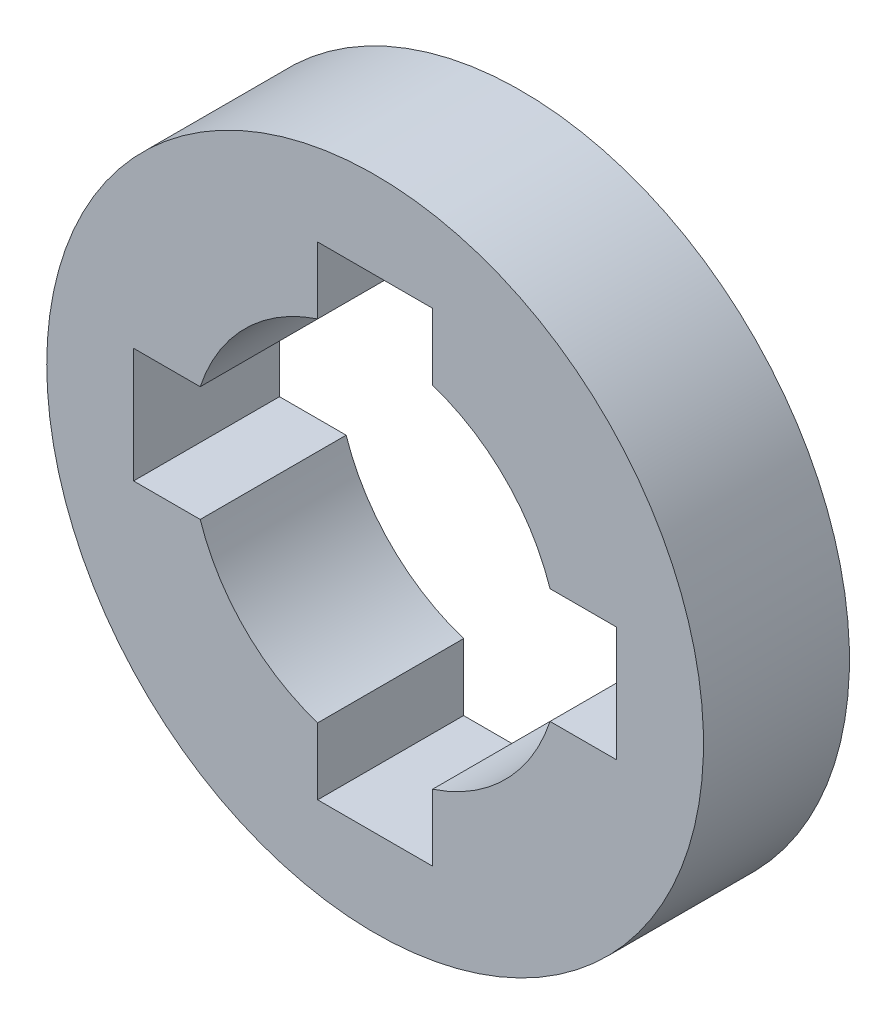
ISO-10303-21;
HEADER;
FILE_DESCRIPTION(('STEP AP214'),'2;1');
FILE_NAME('part.step','',(''),(''),'','','');
FILE_SCHEMA(('AUTOMOTIVE_DESIGN { 1 0 10303 214 1 1 1 1 }'));
ENDSEC;
DATA;
#1=APPLICATION_CONTEXT('core data for automotive mechanical design processes');
#2=APPLICATION_PROTOCOL_DEFINITION('international standard','automotive_design',2000,#1);
#3=PRODUCT_CONTEXT('',#1,'mechanical');
#4=PRODUCT('Part','Part','',(#3));
#5=PRODUCT_RELATED_PRODUCT_CATEGORY('part','',(#4));
#6=PRODUCT_DEFINITION_FORMATION('','',#4);
#7=PRODUCT_DEFINITION_CONTEXT('part definition',#1,'design');
#8=PRODUCT_DEFINITION('design','',#6,#7);
#9=PRODUCT_DEFINITION_SHAPE('','',#8);
#10=(LENGTH_UNIT() NAMED_UNIT(*) SI_UNIT(.MILLI.,.METRE.));
#11=(NAMED_UNIT(*) PLANE_ANGLE_UNIT() SI_UNIT($,.RADIAN.));
#12=(NAMED_UNIT(*) SI_UNIT($,.STERADIAN.) SOLID_ANGLE_UNIT());
#13=UNCERTAINTY_MEASURE_WITH_UNIT(LENGTH_MEASURE(1.E-05),#10,'distance_accuracy_value','');
#14=(GEOMETRIC_REPRESENTATION_CONTEXT(3) GLOBAL_UNCERTAINTY_ASSIGNED_CONTEXT((#13)) GLOBAL_UNIT_ASSIGNED_CONTEXT((#10,
#11,#12)) REPRESENTATION_CONTEXT('',''));
#15=CARTESIAN_POINT('',(0.,0.,0.));
#16=DIRECTION('',(0.,0.,1.));
#17=DIRECTION('',(1.,0.,0.));
#18=AXIS2_PLACEMENT_3D('',#15,#16,#17);
#19=CARTESIAN_POINT('',(0.,1.25,1.5875));
#20=DIRECTION('',(0.,1.,0.));
#21=DIRECTION('',(0.,0.,1.));
#22=AXIS2_PLACEMENT_3D('',#19,#20,#21);
#23=PLANE('',#22);
#24=DIRECTION('',(0.,0.,-1.));
#25=VECTOR('',#24,1.);
#26=CARTESIAN_POINT('',(5.255,1.25,1.5875));
#27=LINE('',#26,#25);
#28=CARTESIAN_POINT('',(5.255,1.25,-1.5875));
#29=VERTEX_POINT('',#28);
#30=CARTESIAN_POINT('',(5.255,1.25,1.5875));
#31=VERTEX_POINT('',#30);
#32=EDGE_CURVE('E151',#29,#31,#27,.F.);
#33=ORIENTED_EDGE('',*,*,#32,.T.);
#34=DIRECTION('',(1.,0.,0.));
#35=VECTOR('',#34,1.);
#36=CARTESIAN_POINT('',(0.,1.25,1.5875));
#37=LINE('',#36,#35);
#38=CARTESIAN_POINT('',(3.80493429641039,1.25,1.5875));
#39=VERTEX_POINT('',#38);
#40=EDGE_CURVE('E223',#39,#31,#37,.T.);
#41=ORIENTED_EDGE('',*,*,#40,.F.);
#42=DIRECTION('',(0.,0.,-1.));
#43=VECTOR('',#42,1.);
#44=CARTESIAN_POINT('',(3.80493429641039,1.25,1.5875));
#45=LINE('',#44,#43);
#46=CARTESIAN_POINT('',(3.80493429641039,1.25,-1.5875));
#47=VERTEX_POINT('',#46);
#48=EDGE_CURVE('E126',#39,#47,#45,.T.);
#49=ORIENTED_EDGE('',*,*,#48,.T.);
#50=DIRECTION('',(1.,0.,0.));
#51=VECTOR('',#50,1.);
#52=CARTESIAN_POINT('',(0.,1.25,-1.5875));
#53=LINE('',#52,#51);
#54=EDGE_CURVE('E148',#47,#29,#53,.T.);
#55=ORIENTED_EDGE('',*,*,#54,.T.);
#56=EDGE_LOOP('',(#33,#41,#49,#55));
#57=FACE_BOUND('',#56,.T.);
#58=ADVANCED_FACE('F17',(#57),#23,.F.);
#59=CARTESIAN_POINT('',(0.,-1.25,1.5875));
#60=DIRECTION('',(0.,1.,0.));
#61=DIRECTION('',(0.,0.,1.));
#62=AXIS2_PLACEMENT_3D('',#59,#60,#61);
#63=PLANE('',#62);
#64=DIRECTION('',(1.,0.,0.));
#65=VECTOR('',#64,1.);
#66=CARTESIAN_POINT('',(0.,-1.25,1.5875));
#67=LINE('',#66,#65);
#68=CARTESIAN_POINT('',(3.80493429641039,-1.25,1.5875));
#69=VERTEX_POINT('',#68);
#70=CARTESIAN_POINT('',(5.255,-1.25,1.5875));
#71=VERTEX_POINT('',#70);
#72=EDGE_CURVE('E219',#69,#71,#67,.T.);
#73=ORIENTED_EDGE('',*,*,#72,.T.);
#74=DIRECTION('',(0.,0.,-1.));
#75=VECTOR('',#74,1.);
#76=CARTESIAN_POINT('',(5.255,-1.25,1.5875));
#77=LINE('',#76,#75);
#78=CARTESIAN_POINT('',(5.255,-1.25,-1.5875));
#79=VERTEX_POINT('',#78);
#80=EDGE_CURVE('E285',#71,#79,#77,.T.);
#81=ORIENTED_EDGE('',*,*,#80,.T.);
#82=DIRECTION('',(1.,0.,0.));
#83=VECTOR('',#82,1.);
#84=CARTESIAN_POINT('',(0.,-1.25,-1.5875));
#85=LINE('',#84,#83);
#86=CARTESIAN_POINT('',(3.80493429641039,-1.25,-1.5875));
#87=VERTEX_POINT('',#86);
#88=EDGE_CURVE('E189',#79,#87,#85,.F.);
#89=ORIENTED_EDGE('',*,*,#88,.T.);
#90=DIRECTION('',(0.,0.,-1.));
#91=VECTOR('',#90,1.);
#92=CARTESIAN_POINT('',(3.80493429641039,-1.25,1.5875));
#93=LINE('',#92,#91);
#94=EDGE_CURVE('E293',#87,#69,#93,.F.);
#95=ORIENTED_EDGE('',*,*,#94,.T.);
#96=EDGE_LOOP('',(#73,#81,#89,#95));
#97=FACE_BOUND('',#96,.T.);
#98=ADVANCED_FACE('F386',(#97),#63,.T.);
#99=CARTESIAN_POINT('',(1.25,0.,1.5875));
#100=DIRECTION('',(1.,0.,0.));
#101=DIRECTION('',(0.,1.,0.));
#102=AXIS2_PLACEMENT_3D('',#99,#100,#101);
#103=PLANE('',#102);
#104=DIRECTION('',(0.,0.,1.));
#105=VECTOR('',#104,1.);
#106=CARTESIAN_POINT('',(1.25,-5.255,1.5875));
#107=LINE('',#106,#105);
#108=CARTESIAN_POINT('',(1.25,-5.255,1.5875));
#109=VERTEX_POINT('',#108);
#110=CARTESIAN_POINT('',(1.25,-5.255,-1.5875));
#111=VERTEX_POINT('',#110);
#112=EDGE_CURVE('E271',#109,#111,#107,.F.);
#113=ORIENTED_EDGE('',*,*,#112,.F.);
#114=DIRECTION('',(0.,1.,0.));
#115=VECTOR('',#114,1.);
#116=CARTESIAN_POINT('',(1.25,0.,1.5875));
#117=LINE('',#116,#115);
#118=CARTESIAN_POINT('',(1.25,-3.80493429641039,1.5875));
#119=VERTEX_POINT('',#118);
#120=EDGE_CURVE('E215',#119,#109,#117,.F.);
#121=ORIENTED_EDGE('',*,*,#120,.F.);
#122=DIRECTION('',(0.,0.,-1.));
#123=VECTOR('',#122,1.);
#124=CARTESIAN_POINT('',(1.25,-3.80493429641038,1.5875));
#125=LINE('',#124,#123);
#126=CARTESIAN_POINT('',(1.25,-3.80493429641039,-1.5875));
#127=VERTEX_POINT('',#126);
#128=EDGE_CURVE('E163',#119,#127,#125,.T.);
#129=ORIENTED_EDGE('',*,*,#128,.T.);
#130=DIRECTION('',(0.,1.,0.));
#131=VECTOR('',#130,1.);
#132=CARTESIAN_POINT('',(1.25,0.,-1.5875));
#133=LINE('',#132,#131);
#134=EDGE_CURVE('E184',#127,#111,#133,.F.);
#135=ORIENTED_EDGE('',*,*,#134,.T.);
#136=EDGE_LOOP('',(#113,#121,#129,#135));
#137=FACE_BOUND('',#136,.T.);
#138=ADVANCED_FACE('F553',(#137),#103,.F.);
#139=CARTESIAN_POINT('',(-1.25,0.,1.5875));
#140=DIRECTION('',(1.,0.,0.));
#141=DIRECTION('',(0.,1.,0.));
#142=AXIS2_PLACEMENT_3D('',#139,#140,#141);
#143=PLANE('',#142);
#144=DIRECTION('',(0.,1.,0.));
#145=VECTOR('',#144,1.);
#146=CARTESIAN_POINT('',(-1.25,0.,1.5875));
#147=LINE('',#146,#145);
#148=CARTESIAN_POINT('',(-1.25,-3.80493429641039,1.5875));
#149=VERTEX_POINT('',#148);
#150=CARTESIAN_POINT('',(-1.25,-5.255,1.5875));
#151=VERTEX_POINT('',#150);
#152=EDGE_CURVE('E211',#149,#151,#147,.F.);
#153=ORIENTED_EDGE('',*,*,#152,.T.);
#154=DIRECTION('',(0.,0.,1.));
#155=VECTOR('',#154,1.);
#156=CARTESIAN_POINT('',(-1.25,-5.255,1.5875));
#157=LINE('',#156,#155);
#158=CARTESIAN_POINT('',(-1.25,-5.255,-1.5875));
#159=VERTEX_POINT('',#158);
#160=EDGE_CURVE('E268',#159,#151,#157,.T.);
#161=ORIENTED_EDGE('',*,*,#160,.F.);
#162=DIRECTION('',(0.,1.,0.));
#163=VECTOR('',#162,1.);
#164=CARTESIAN_POINT('',(-1.25,0.,-1.5875));
#165=LINE('',#164,#163);
#166=CARTESIAN_POINT('',(-1.25,-3.80493429641039,-1.5875));
#167=VERTEX_POINT('',#166);
#168=EDGE_CURVE('E180',#159,#167,#165,.T.);
#169=ORIENTED_EDGE('',*,*,#168,.T.);
#170=DIRECTION('',(0.,0.,-1.));
#171=VECTOR('',#170,1.);
#172=CARTESIAN_POINT('',(-1.25,-3.80493429641039,1.5875));
#173=LINE('',#172,#171);
#174=EDGE_CURVE('E282',#167,#149,#173,.F.);
#175=ORIENTED_EDGE('',*,*,#174,.T.);
#176=EDGE_LOOP('',(#153,#161,#169,#175));
#177=FACE_BOUND('',#176,.T.);
#178=ADVANCED_FACE('F544',(#177),#143,.T.);
#179=CARTESIAN_POINT('',(0.,-1.25,1.5875));
#180=DIRECTION('',(0.,1.,0.));
#181=DIRECTION('',(0.,0.,1.));
#182=AXIS2_PLACEMENT_3D('',#179,#180,#181);
#183=PLANE('',#182);
#184=DIRECTION('',(1.,0.,0.));
#185=VECTOR('',#184,1.);
#186=CARTESIAN_POINT('',(0.,-1.25,1.5875));
#187=LINE('',#186,#185);
#188=CARTESIAN_POINT('',(-5.255,-1.25,1.5875));
#189=VERTEX_POINT('',#188);
#190=CARTESIAN_POINT('',(-3.80493429641039,-1.25,1.5875));
#191=VERTEX_POINT('',#190);
#192=EDGE_CURVE('E207',#189,#191,#187,.T.);
#193=ORIENTED_EDGE('',*,*,#192,.T.);
#194=DIRECTION('',(0.,0.,-1.));
#195=VECTOR('',#194,1.);
#196=CARTESIAN_POINT('',(-3.80493429641039,-1.25,1.5875));
#197=LINE('',#196,#195);
#198=CARTESIAN_POINT('',(-3.80493429641039,-1.25,-1.5875));
#199=VERTEX_POINT('',#198);
#200=EDGE_CURVE('E342',#191,#199,#197,.T.);
#201=ORIENTED_EDGE('',*,*,#200,.T.);
#202=DIRECTION('',(1.,0.,0.));
#203=VECTOR('',#202,1.);
#204=CARTESIAN_POINT('',(0.,-1.25,-1.5875));
#205=LINE('',#204,#203);
#206=CARTESIAN_POINT('',(-5.255,-1.25,-1.5875));
#207=VERTEX_POINT('',#206);
#208=EDGE_CURVE('E175',#199,#207,#205,.F.);
#209=ORIENTED_EDGE('',*,*,#208,.T.);
#210=DIRECTION('',(0.,0.,-1.));
#211=VECTOR('',#210,1.);
#212=CARTESIAN_POINT('',(-5.255,-1.25,1.5875));
#213=LINE('',#212,#211);
#214=EDGE_CURVE('E254',#189,#207,#213,.T.);
#215=ORIENTED_EDGE('',*,*,#214,.F.);
#216=EDGE_LOOP('',(#193,#201,#209,#215));
#217=FACE_BOUND('',#216,.T.);
#218=ADVANCED_FACE('F408',(#217),#183,.T.);
#219=CARTESIAN_POINT('',(0.,1.25,1.5875));
#220=DIRECTION('',(0.,1.,0.));
#221=DIRECTION('',(0.,0.,1.));
#222=AXIS2_PLACEMENT_3D('',#219,#220,#221);
#223=PLANE('',#222);
#224=DIRECTION('',(0.,0.,-1.));
#225=VECTOR('',#224,1.);
#226=CARTESIAN_POINT('',(-3.80493429641039,1.25,1.5875));
#227=LINE('',#226,#225);
#228=CARTESIAN_POINT('',(-3.80493429641039,1.25,-1.5875));
#229=VERTEX_POINT('',#228);
#230=CARTESIAN_POINT('',(-3.80493429641039,1.25,1.5875));
#231=VERTEX_POINT('',#230);
#232=EDGE_CURVE('E265',#229,#231,#227,.F.);
#233=ORIENTED_EDGE('',*,*,#232,.T.);
#234=DIRECTION('',(1.,0.,0.));
#235=VECTOR('',#234,1.);
#236=CARTESIAN_POINT('',(0.,1.25,1.5875));
#237=LINE('',#236,#235);
#238=CARTESIAN_POINT('',(-5.255,1.25,1.5875));
#239=VERTEX_POINT('',#238);
#240=EDGE_CURVE('E202',#239,#231,#237,.T.);
#241=ORIENTED_EDGE('',*,*,#240,.F.);
#242=DIRECTION('',(0.,0.,-1.));
#243=VECTOR('',#242,1.);
#244=CARTESIAN_POINT('',(-5.255,1.25,1.5875));
#245=LINE('',#244,#243);
#246=CARTESIAN_POINT('',(-5.255,1.25,-1.5875));
#247=VERTEX_POINT('',#246);
#248=EDGE_CURVE('E250',#247,#239,#245,.F.);
#249=ORIENTED_EDGE('',*,*,#248,.F.);
#250=DIRECTION('',(1.,0.,0.));
#251=VECTOR('',#250,1.);
#252=CARTESIAN_POINT('',(0.,1.25,-1.5875));
#253=LINE('',#252,#251);
#254=EDGE_CURVE('E171',#247,#229,#253,.T.);
#255=ORIENTED_EDGE('',*,*,#254,.T.);
#256=EDGE_LOOP('',(#233,#241,#249,#255));
#257=FACE_BOUND('',#256,.T.);
#258=ADVANCED_FACE('F364',(#257),#223,.F.);
#259=CARTESIAN_POINT('',(-1.25,0.,1.5875));
#260=DIRECTION('',(1.,0.,0.));
#261=DIRECTION('',(0.,1.,0.));
#262=AXIS2_PLACEMENT_3D('',#259,#260,#261);
#263=PLANE('',#262);
#264=DIRECTION('',(0.,1.,0.));
#265=VECTOR('',#264,1.);
#266=CARTESIAN_POINT('',(-1.25,0.,1.5875));
#267=LINE('',#266,#265);
#268=CARTESIAN_POINT('',(-1.25,5.255,1.5875));
#269=VERTEX_POINT('',#268);
#270=CARTESIAN_POINT('',(-1.25,3.80493429641039,1.5875));
#271=VERTEX_POINT('',#270);
#272=EDGE_CURVE('E199',#269,#271,#267,.F.);
#273=ORIENTED_EDGE('',*,*,#272,.T.);
#274=DIRECTION('',(0.,0.,-1.));
#275=VECTOR('',#274,1.);
#276=CARTESIAN_POINT('',(-1.25,3.80493429641039,1.5875));
#277=LINE('',#276,#275);
#278=CARTESIAN_POINT('',(-1.25,3.80493429641039,-1.5875));
#279=VERTEX_POINT('',#278);
#280=EDGE_CURVE('E340',#271,#279,#277,.T.);
#281=ORIENTED_EDGE('',*,*,#280,.T.);
#282=DIRECTION('',(0.,1.,0.));
#283=VECTOR('',#282,1.);
#284=CARTESIAN_POINT('',(-1.25,0.,-1.5875));
#285=LINE('',#284,#283);
#286=CARTESIAN_POINT('',(-1.25,5.255,-1.5875));
#287=VERTEX_POINT('',#286);
#288=EDGE_CURVE('E143',#279,#287,#285,.T.);
#289=ORIENTED_EDGE('',*,*,#288,.T.);
#290=DIRECTION('',(0.,0.,1.));
#291=VECTOR('',#290,1.);
#292=CARTESIAN_POINT('',(-1.25,5.255,1.5875));
#293=LINE('',#292,#291);
#294=EDGE_CURVE('E236',#287,#269,#293,.T.);
#295=ORIENTED_EDGE('',*,*,#294,.T.);
#296=EDGE_LOOP('',(#273,#281,#289,#295));
#297=FACE_BOUND('',#296,.T.);
#298=ADVANCED_FACE('F399',(#297),#263,.T.);
#299=CARTESIAN_POINT('',(1.25,0.,1.5875));
#300=DIRECTION('',(1.,0.,0.));
#301=DIRECTION('',(0.,1.,0.));
#302=AXIS2_PLACEMENT_3D('',#299,#300,#301);
#303=PLANE('',#302);
#304=DIRECTION('',(0.,0.,-1.));
#305=VECTOR('',#304,1.);
#306=CARTESIAN_POINT('',(1.25,3.80493429641039,1.5875));
#307=LINE('',#306,#305);
#308=CARTESIAN_POINT('',(1.25,3.80493429641039,-1.5875));
#309=VERTEX_POINT('',#308);
#310=CARTESIAN_POINT('',(1.25,3.80493429641039,1.5875));
#311=VERTEX_POINT('',#310);
#312=EDGE_CURVE('E136',#309,#311,#307,.F.);
#313=ORIENTED_EDGE('',*,*,#312,.T.);
#314=DIRECTION('',(0.,1.,0.));
#315=VECTOR('',#314,1.);
#316=CARTESIAN_POINT('',(1.25,0.,1.5875));
#317=LINE('',#316,#315);
#318=CARTESIAN_POINT('',(1.25,5.255,1.5875));
#319=VERTEX_POINT('',#318);
#320=EDGE_CURVE('E39',#319,#311,#317,.F.);
#321=ORIENTED_EDGE('',*,*,#320,.F.);
#322=DIRECTION('',(0.,0.,1.));
#323=VECTOR('',#322,1.);
#324=CARTESIAN_POINT('',(1.25,5.255,1.5875));
#325=LINE('',#324,#323);
#326=CARTESIAN_POINT('',(1.25,5.255,-1.5875));
#327=VERTEX_POINT('',#326);
#328=EDGE_CURVE('E138',#319,#327,#325,.F.);
#329=ORIENTED_EDGE('',*,*,#328,.T.);
#330=DIRECTION('',(0.,1.,0.));
#331=VECTOR('',#330,1.);
#332=CARTESIAN_POINT('',(1.25,0.,-1.5875));
#333=LINE('',#332,#331);
#334=EDGE_CURVE('E132',#327,#309,#333,.F.);
#335=ORIENTED_EDGE('',*,*,#334,.T.);
#336=EDGE_LOOP('',(#313,#321,#329,#335));
#337=FACE_BOUND('',#336,.T.);
#338=ADVANCED_FACE('F134',(#337),#303,.F.);
#339=CARTESIAN_POINT('',(0.,0.,-1.5875));
#340=DIRECTION('',(0.,0.,1.));
#341=DIRECTION('',(1.,0.,0.));
#342=AXIS2_PLACEMENT_3D('',#339,#340,#341);
#343=PLANE('',#342);
#344=CARTESIAN_POINT('',(0.,0.,-1.5875));
#345=DIRECTION('',(0.,0.,-1.));
#346=DIRECTION('',(-1.,0.,0.));
#347=AXIS2_PLACEMENT_3D('',#344,#345,#346);
#348=CIRCLE('',#347,7.14375);
#349=CARTESIAN_POINT('',(-7.14375,0.,-1.5875));
#350=VERTEX_POINT('',#349);
#351=EDGE_CURVE('E241',#350,#350,#348,.F.);
#352=ORIENTED_EDGE('',*,*,#351,.F.);
#353=EDGE_LOOP('',(#352));
#354=FACE_BOUND('',#353,.T.);
#355=ORIENTED_EDGE('',*,*,#334,.F.);
#356=DIRECTION('',(1.,0.,0.));
#357=VECTOR('',#356,1.);
#358=CARTESIAN_POINT('',(0.,5.255,-1.5875));
#359=LINE('',#358,#357);
#360=EDGE_CURVE('E235',#327,#287,#359,.F.);
#361=ORIENTED_EDGE('',*,*,#360,.T.);
#362=ORIENTED_EDGE('',*,*,#288,.F.);
#363=CARTESIAN_POINT('',(0.,0.,-1.5875));
#364=DIRECTION('',(0.,0.,-1.));
#365=DIRECTION('',(-1.,0.,0.));
#366=AXIS2_PLACEMENT_3D('',#363,#364,#365);
#367=CIRCLE('',#366,4.005);
#368=EDGE_CURVE('E247',#279,#229,#367,.F.);
#369=ORIENTED_EDGE('',*,*,#368,.T.);
#370=ORIENTED_EDGE('',*,*,#254,.F.);
#371=DIRECTION('',(0.,1.,0.));
#372=VECTOR('',#371,1.);
#373=CARTESIAN_POINT('',(-5.255,0.,-1.5875));
#374=LINE('',#373,#372);
#375=EDGE_CURVE('E255',#207,#247,#374,.T.);
#376=ORIENTED_EDGE('',*,*,#375,.F.);
#377=ORIENTED_EDGE('',*,*,#208,.F.);
#378=CARTESIAN_POINT('',(0.,0.,-1.5875));
#379=DIRECTION('',(0.,0.,-1.));
#380=DIRECTION('',(-1.,0.,0.));
#381=AXIS2_PLACEMENT_3D('',#378,#379,#380);
#382=CIRCLE('',#381,4.005);
#383=EDGE_CURVE('E260',#199,#167,#382,.F.);
#384=ORIENTED_EDGE('',*,*,#383,.T.);
#385=ORIENTED_EDGE('',*,*,#168,.F.);
#386=DIRECTION('',(1.,0.,0.));
#387=VECTOR('',#386,1.);
#388=CARTESIAN_POINT('',(0.,-5.255,-1.5875));
#389=LINE('',#388,#387);
#390=EDGE_CURVE('E272',#111,#159,#389,.F.);
#391=ORIENTED_EDGE('',*,*,#390,.F.);
#392=ORIENTED_EDGE('',*,*,#134,.F.);
#393=CARTESIAN_POINT('',(0.,0.,-1.5875));
#394=DIRECTION('',(0.,0.,-1.));
#395=DIRECTION('',(-1.,0.,0.));
#396=AXIS2_PLACEMENT_3D('',#393,#394,#395);
#397=CIRCLE('',#396,4.005);
#398=EDGE_CURVE('E277',#127,#87,#397,.F.);
#399=ORIENTED_EDGE('',*,*,#398,.T.);
#400=ORIENTED_EDGE('',*,*,#88,.F.);
#401=DIRECTION('',(0.,1.,0.));
#402=VECTOR('',#401,1.);
#403=CARTESIAN_POINT('',(5.255,0.,-1.5875));
#404=LINE('',#403,#402);
#405=EDGE_CURVE('E288',#79,#29,#404,.T.);
#406=ORIENTED_EDGE('',*,*,#405,.T.);
#407=ORIENTED_EDGE('',*,*,#54,.F.);
#408=CARTESIAN_POINT('',(0.,0.,-1.5875));
#409=DIRECTION('',(0.,0.,-1.));
#410=DIRECTION('',(-1.,0.,0.));
#411=AXIS2_PLACEMENT_3D('',#408,#409,#410);
#412=CIRCLE('',#411,4.005);
#413=EDGE_CURVE('E20',#47,#309,#412,.F.);
#414=ORIENTED_EDGE('',*,*,#413,.T.);
#415=EDGE_LOOP('',(#355,#361,#362,#369,#370,#376,#377,#384,#385,#391,#392,#399,#400,#406,#407,#414));
#416=FACE_BOUND('',#415,.T.);
#417=ADVANCED_FACE('F146',(#354,#416),#343,.F.);
#418=CARTESIAN_POINT('',(0.,0.,1.5875));
#419=DIRECTION('',(0.,0.,-1.));
#420=DIRECTION('',(-1.,0.,0.));
#421=AXIS2_PLACEMENT_3D('',#418,#419,#420);
#422=CYLINDRICAL_SURFACE('',#421,4.005);
#423=ORIENTED_EDGE('',*,*,#48,.F.);
#424=CARTESIAN_POINT('',(0.,0.,1.5875));
#425=DIRECTION('',(0.,0.,-1.));
#426=DIRECTION('',(-1.,0.,0.));
#427=AXIS2_PLACEMENT_3D('',#424,#425,#426);
#428=CIRCLE('',#427,4.005);
#429=EDGE_CURVE('E154',#311,#39,#428,.T.);
#430=ORIENTED_EDGE('',*,*,#429,.F.);
#431=ORIENTED_EDGE('',*,*,#312,.F.);
#432=ORIENTED_EDGE('',*,*,#413,.F.);
#433=EDGE_LOOP('',(#423,#430,#431,#432));
#434=FACE_BOUND('',#433,.T.);
#435=ADVANCED_FACE('F152',(#434),#422,.F.);
#436=CARTESIAN_POINT('',(5.255,0.,1.5875));
#437=DIRECTION('',(1.,0.,0.));
#438=DIRECTION('',(0.,0.,-1.));
#439=AXIS2_PLACEMENT_3D('',#436,#437,#438);
#440=PLANE('',#439);
#441=ORIENTED_EDGE('',*,*,#80,.F.);
#442=DIRECTION('',(0.,1.,0.));
#443=VECTOR('',#442,1.);
#444=CARTESIAN_POINT('',(5.255,0.,1.5875));
#445=LINE('',#444,#443);
#446=EDGE_CURVE('E320',#31,#71,#445,.F.);
#447=ORIENTED_EDGE('',*,*,#446,.F.);
#448=ORIENTED_EDGE('',*,*,#32,.F.);
#449=ORIENTED_EDGE('',*,*,#405,.F.);
#450=EDGE_LOOP('',(#441,#447,#448,#449));
#451=FACE_BOUND('',#450,.T.);
#452=ADVANCED_FACE('F391',(#451),#440,.F.);
#453=CARTESIAN_POINT('',(0.,0.,1.5875));
#454=DIRECTION('',(0.,0.,-1.));
#455=DIRECTION('',(-1.,0.,0.));
#456=AXIS2_PLACEMENT_3D('',#453,#454,#455);
#457=CYLINDRICAL_SURFACE('',#456,4.005);
#458=ORIENTED_EDGE('',*,*,#128,.F.);
#459=CARTESIAN_POINT('',(0.,0.,1.5875));
#460=DIRECTION('',(0.,0.,-1.));
#461=DIRECTION('',(-1.,0.,0.));
#462=AXIS2_PLACEMENT_3D('',#459,#460,#461);
#463=CIRCLE('',#462,4.005);
#464=EDGE_CURVE('E317',#69,#119,#463,.T.);
#465=ORIENTED_EDGE('',*,*,#464,.F.);
#466=ORIENTED_EDGE('',*,*,#94,.F.);
#467=ORIENTED_EDGE('',*,*,#398,.F.);
#468=EDGE_LOOP('',(#458,#465,#466,#467));
#469=FACE_BOUND('',#468,.T.);
#470=ADVANCED_FACE('F433',(#469),#457,.F.);
#471=CARTESIAN_POINT('',(0.,-5.255,1.5875));
#472=DIRECTION('',(0.,1.,0.));
#473=DIRECTION('',(0.,0.,1.));
#474=AXIS2_PLACEMENT_3D('',#471,#472,#473);
#475=PLANE('',#474);
#476=DIRECTION('',(1.,0.,0.));
#477=VECTOR('',#476,1.);
#478=CARTESIAN_POINT('',(0.,-5.255,1.5875));
#479=LINE('',#478,#477);
#480=EDGE_CURVE('E314',#109,#151,#479,.F.);
#481=ORIENTED_EDGE('',*,*,#480,.F.);
#482=ORIENTED_EDGE('',*,*,#112,.T.);
#483=ORIENTED_EDGE('',*,*,#390,.T.);
#484=ORIENTED_EDGE('',*,*,#160,.T.);
#485=EDGE_LOOP('',(#481,#482,#483,#484));
#486=FACE_BOUND('',#485,.T.);
#487=ADVANCED_FACE('F429',(#486),#475,.T.);
#488=CARTESIAN_POINT('',(0.,0.,1.5875));
#489=DIRECTION('',(0.,0.,-1.));
#490=DIRECTION('',(-1.,0.,0.));
#491=AXIS2_PLACEMENT_3D('',#488,#489,#490);
#492=CYLINDRICAL_SURFACE('',#491,4.005);
#493=ORIENTED_EDGE('',*,*,#200,.F.);
#494=CARTESIAN_POINT('',(0.,0.,1.5875));
#495=DIRECTION('',(0.,0.,-1.));
#496=DIRECTION('',(-1.,0.,0.));
#497=AXIS2_PLACEMENT_3D('',#494,#495,#496);
#498=CIRCLE('',#497,4.005);
#499=EDGE_CURVE('E311',#149,#191,#498,.T.);
#500=ORIENTED_EDGE('',*,*,#499,.F.);
#501=ORIENTED_EDGE('',*,*,#174,.F.);
#502=ORIENTED_EDGE('',*,*,#383,.F.);
#503=EDGE_LOOP('',(#493,#500,#501,#502));
#504=FACE_BOUND('',#503,.T.);
#505=ADVANCED_FACE('F426',(#504),#492,.F.);
#506=CARTESIAN_POINT('',(-5.255,0.,1.5875));
#507=DIRECTION('',(1.,0.,0.));
#508=DIRECTION('',(0.,0.,-1.));
#509=AXIS2_PLACEMENT_3D('',#506,#507,#508);
#510=PLANE('',#509);
#511=DIRECTION('',(0.,1.,0.));
#512=VECTOR('',#511,1.);
#513=CARTESIAN_POINT('',(-5.255,0.,1.5875));
#514=LINE('',#513,#512);
#515=EDGE_CURVE('E307',#189,#239,#514,.T.);
#516=ORIENTED_EDGE('',*,*,#515,.F.);
#517=ORIENTED_EDGE('',*,*,#214,.T.);
#518=ORIENTED_EDGE('',*,*,#375,.T.);
#519=ORIENTED_EDGE('',*,*,#248,.T.);
#520=EDGE_LOOP('',(#516,#517,#518,#519));
#521=FACE_BOUND('',#520,.T.);
#522=ADVANCED_FACE('F376',(#521),#510,.T.);
#523=CARTESIAN_POINT('',(0.,0.,1.5875));
#524=DIRECTION('',(0.,0.,-1.));
#525=DIRECTION('',(-1.,0.,0.));
#526=AXIS2_PLACEMENT_3D('',#523,#524,#525);
#527=CYLINDRICAL_SURFACE('',#526,4.005);
#528=ORIENTED_EDGE('',*,*,#280,.F.);
#529=CARTESIAN_POINT('',(0.,0.,1.5875));
#530=DIRECTION('',(0.,0.,-1.));
#531=DIRECTION('',(-1.,0.,0.));
#532=AXIS2_PLACEMENT_3D('',#529,#530,#531);
#533=CIRCLE('',#532,4.005);
#534=EDGE_CURVE('E304',#231,#271,#533,.T.);
#535=ORIENTED_EDGE('',*,*,#534,.F.);
#536=ORIENTED_EDGE('',*,*,#232,.F.);
#537=ORIENTED_EDGE('',*,*,#368,.F.);
#538=EDGE_LOOP('',(#528,#535,#536,#537));
#539=FACE_BOUND('',#538,.T.);
#540=ADVANCED_FACE('F370',(#539),#527,.F.);
#541=CARTESIAN_POINT('',(0.,5.255,1.5875));
#542=DIRECTION('',(0.,1.,0.));
#543=DIRECTION('',(0.,0.,1.));
#544=AXIS2_PLACEMENT_3D('',#541,#542,#543);
#545=PLANE('',#544);
#546=ORIENTED_EDGE('',*,*,#328,.F.);
#547=DIRECTION('',(1.,0.,0.));
#548=VECTOR('',#547,1.);
#549=CARTESIAN_POINT('',(0.,5.255,1.5875));
#550=LINE('',#549,#548);
#551=EDGE_CURVE('E27',#269,#319,#550,.T.);
#552=ORIENTED_EDGE('',*,*,#551,.F.);
#553=ORIENTED_EDGE('',*,*,#294,.F.);
#554=ORIENTED_EDGE('',*,*,#360,.F.);
#555=EDGE_LOOP('',(#546,#552,#553,#554));
#556=FACE_BOUND('',#555,.T.);
#557=ADVANCED_FACE('F395',(#556),#545,.F.);
#558=CARTESIAN_POINT('',(0.,0.,1.5875));
#559=DIRECTION('',(0.,0.,-1.));
#560=DIRECTION('',(-1.,0.,0.));
#561=AXIS2_PLACEMENT_3D('',#558,#559,#560);
#562=CYLINDRICAL_SURFACE('',#561,7.14375);
#563=ORIENTED_EDGE('',*,*,#351,.T.);
#564=EDGE_LOOP('',(#563));
#565=FACE_BOUND('',#564,.T.);
#566=CARTESIAN_POINT('',(0.,0.,1.5875));
#567=DIRECTION('',(0.,0.,-1.));
#568=DIRECTION('',(-1.,0.,0.));
#569=AXIS2_PLACEMENT_3D('',#566,#567,#568);
#570=CIRCLE('',#569,7.14375);
#571=CARTESIAN_POINT('',(-7.14375,0.,1.5875));
#572=VERTEX_POINT('',#571);
#573=EDGE_CURVE('E11',#572,#572,#570,.F.);
#574=ORIENTED_EDGE('',*,*,#573,.F.);
#575=EDGE_LOOP('',(#574));
#576=FACE_BOUND('',#575,.T.);
#577=ADVANCED_FACE('F411',(#565,#576),#562,.T.);
#578=CARTESIAN_POINT('',(0.,0.,1.5875));
#579=DIRECTION('',(0.,0.,1.));
#580=DIRECTION('',(1.,0.,0.));
#581=AXIS2_PLACEMENT_3D('',#578,#579,#580);
#582=PLANE('',#581);
#583=ORIENTED_EDGE('',*,*,#573,.T.);
#584=EDGE_LOOP('',(#583));
#585=FACE_BOUND('',#584,.T.);
#586=ORIENTED_EDGE('',*,*,#551,.T.);
#587=ORIENTED_EDGE('',*,*,#320,.T.);
#588=ORIENTED_EDGE('',*,*,#429,.T.);
#589=ORIENTED_EDGE('',*,*,#40,.T.);
#590=ORIENTED_EDGE('',*,*,#446,.T.);
#591=ORIENTED_EDGE('',*,*,#72,.F.);
#592=ORIENTED_EDGE('',*,*,#464,.T.);
#593=ORIENTED_EDGE('',*,*,#120,.T.);
#594=ORIENTED_EDGE('',*,*,#480,.T.);
#595=ORIENTED_EDGE('',*,*,#152,.F.);
#596=ORIENTED_EDGE('',*,*,#499,.T.);
#597=ORIENTED_EDGE('',*,*,#192,.F.);
#598=ORIENTED_EDGE('',*,*,#515,.T.);
#599=ORIENTED_EDGE('',*,*,#240,.T.);
#600=ORIENTED_EDGE('',*,*,#534,.T.);
#601=ORIENTED_EDGE('',*,*,#272,.F.);
#602=EDGE_LOOP('',(#586,#587,#588,#589,#590,#591,#592,#593,#594,#595,#596,#597,#598,#599,#600,#601));
#603=FACE_BOUND('',#602,.T.);
#604=ADVANCED_FACE('F372',(#585,#603),#582,.T.);
#605=CLOSED_SHELL('',(#58,#98,#138,#178,#218,#258,#298,#338,#417,#435,#452,#470,#487,#505,#522,
#540,#557,#577,#604));
#606=MANIFOLD_SOLID_BREP('B1',#605);
#607=ADVANCED_BREP_SHAPE_REPRESENTATION('',(#18,#606),#14);
#608=SHAPE_DEFINITION_REPRESENTATION(#9,#607);
ENDSEC;
END-ISO-10303-21;
